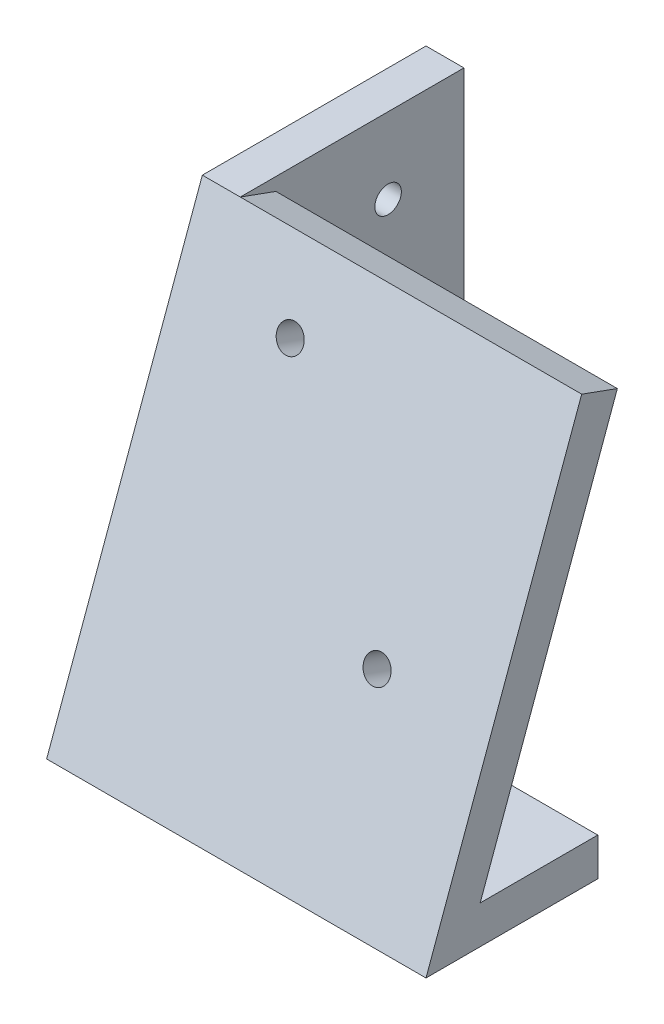
ISO-10303-21;
HEADER;
FILE_DESCRIPTION(('STEP AP214'),'2;1');
FILE_NAME('part.step','',(''),(''),'','','');
FILE_SCHEMA(('AUTOMOTIVE_DESIGN { 1 0 10303 214 1 1 1 1 }'));
ENDSEC;
DATA;
#1=APPLICATION_CONTEXT('core data for automotive mechanical design processes');
#2=APPLICATION_PROTOCOL_DEFINITION('international standard','automotive_design',2000,#1);
#3=PRODUCT_CONTEXT('',#1,'mechanical');
#4=PRODUCT('Part','Part','',(#3));
#5=PRODUCT_RELATED_PRODUCT_CATEGORY('part','',(#4));
#6=PRODUCT_DEFINITION_FORMATION('','',#4);
#7=PRODUCT_DEFINITION_CONTEXT('part definition',#1,'design');
#8=PRODUCT_DEFINITION('design','',#6,#7);
#9=PRODUCT_DEFINITION_SHAPE('','',#8);
#10=(LENGTH_UNIT() NAMED_UNIT(*) SI_UNIT(.MILLI.,.METRE.));
#11=(NAMED_UNIT(*) PLANE_ANGLE_UNIT() SI_UNIT($,.RADIAN.));
#12=(NAMED_UNIT(*) SI_UNIT($,.STERADIAN.) SOLID_ANGLE_UNIT());
#13=UNCERTAINTY_MEASURE_WITH_UNIT(LENGTH_MEASURE(1.E-05),#10,'distance_accuracy_value','');
#14=(GEOMETRIC_REPRESENTATION_CONTEXT(3) GLOBAL_UNCERTAINTY_ASSIGNED_CONTEXT((#13)) GLOBAL_UNIT_ASSIGNED_CONTEXT((#10,
#11,#12)) REPRESENTATION_CONTEXT('',''));
#15=CARTESIAN_POINT('',(0.,0.,0.));
#16=DIRECTION('',(0.,0.,1.));
#17=DIRECTION('',(1.,0.,0.));
#18=AXIS2_PLACEMENT_3D('',#15,#16,#17);
#19=CARTESIAN_POINT('',(25.,5.,42.8592599662894));
#20=DIRECTION('',(0.,-1.,0.));
#21=DIRECTION('',(0.,0.,-1.));
#22=AXIS2_PLACEMENT_3D('',#19,#20,#21);
#23=PLANE('',#22);
#24=CARTESIAN_POINT('',(-10.,5.,32.6992599662894));
#25=DIRECTION('',(0.,1.,0.));
#26=DIRECTION('',(0.,0.,1.));
#27=AXIS2_PLACEMENT_3D('',#24,#25,#26);
#28=CIRCLE('',#27,1.75);
#29=CARTESIAN_POINT('',(-10.,5.,34.4492599662894));
#30=VERTEX_POINT('',#29);
#31=EDGE_CURVE('E215',#30,#30,#28,.T.);
#32=ORIENTED_EDGE('',*,*,#31,.F.);
#33=EDGE_LOOP('',(#32));
#34=FACE_BOUND('',#33,.T.);
#35=CARTESIAN_POINT('',(10.,5.,32.6992599662894));
#36=DIRECTION('',(0.,1.,0.));
#37=DIRECTION('',(0.,0.,1.));
#38=AXIS2_PLACEMENT_3D('',#35,#36,#37);
#39=CIRCLE('',#38,1.75);
#40=CARTESIAN_POINT('',(10.,5.,34.4492599662894));
#41=VERTEX_POINT('',#40);
#42=EDGE_CURVE('E209',#41,#41,#39,.T.);
#43=ORIENTED_EDGE('',*,*,#42,.F.);
#44=EDGE_LOOP('',(#43));
#45=FACE_BOUND('',#44,.T.);
#46=DIRECTION('',(1.,0.,0.));
#47=VECTOR('',#46,1.);
#48=CARTESIAN_POINT('',(-8.36220000000002,5.,27.3622));
#49=LINE('',#48,#47);
#50=CARTESIAN_POINT('',(-8.36220000000002,5.,27.3622));
#51=VERTEX_POINT('',#50);
#52=CARTESIAN_POINT('',(25.,5.,27.3622));
#53=VERTEX_POINT('',#52);
#54=EDGE_CURVE('E139',#51,#53,#49,.T.);
#55=ORIENTED_EDGE('',*,*,#54,.F.);
#56=DIRECTION('',(0.,0.,1.));
#57=VECTOR('',#56,1.);
#58=CARTESIAN_POINT('',(-8.36220000000002,5.,5.));
#59=LINE('',#58,#57);
#60=CARTESIAN_POINT('',(-8.36220000000002,5.,5.));
#61=VERTEX_POINT('',#60);
#62=EDGE_CURVE('E122',#61,#51,#59,.T.);
#63=ORIENTED_EDGE('',*,*,#62,.F.);
#64=DIRECTION('',(1.,0.,0.));
#65=VECTOR('',#64,1.);
#66=CARTESIAN_POINT('',(-20.,5.,5.));
#67=LINE('',#66,#65);
#68=CARTESIAN_POINT('',(-20.,5.,5.));
#69=VERTEX_POINT('',#68);
#70=EDGE_CURVE('E150',#69,#61,#67,.T.);
#71=ORIENTED_EDGE('',*,*,#70,.F.);
#72=DIRECTION('',(0.,0.,1.));
#73=VECTOR('',#72,1.);
#74=CARTESIAN_POINT('',(-20.,5.,50.002));
#75=LINE('',#74,#73);
#76=CARTESIAN_POINT('',(-20.,5.,42.8592599662894));
#77=VERTEX_POINT('',#76);
#78=EDGE_CURVE('E63',#69,#77,#75,.T.);
#79=ORIENTED_EDGE('',*,*,#78,.T.);
#80=DIRECTION('',(-1.,0.,0.));
#81=VECTOR('',#80,1.);
#82=CARTESIAN_POINT('',(25.,5.,42.8592599662894));
#83=LINE('',#82,#81);
#84=CARTESIAN_POINT('',(25.,5.,42.8592599662894));
#85=VERTEX_POINT('',#84);
#86=EDGE_CURVE('E11',#85,#77,#83,.T.);
#87=ORIENTED_EDGE('',*,*,#86,.F.);
#88=DIRECTION('',(0.,0.,-1.));
#89=VECTOR('',#88,1.);
#90=CARTESIAN_POINT('',(25.,5.,0.));
#91=LINE('',#90,#89);
#92=EDGE_CURVE('E156',#85,#53,#91,.T.);
#93=ORIENTED_EDGE('',*,*,#92,.T.);
#94=EDGE_LOOP('',(#55,#63,#71,#79,#87,#93));
#95=FACE_BOUND('',#94,.T.);
#96=ADVANCED_FACE('F40',(#34,#45,#95),#23,.F.);
#97=CARTESIAN_POINT('',(25.,54.6714565305261,24.7803282965301));
#98=DIRECTION('',(0.,0.342020143325673,0.939692620785907));
#99=DIRECTION('',(0.,-0.939692620785907,0.342020143325673));
#100=AXIS2_PLACEMENT_3D('',#97,#98,#99);
#101=PLANE('',#100);
#102=CARTESIAN_POINT('',(10.,21.7822148030193,36.7510333129287));
#103=DIRECTION('',(0.,0.342020143325672,0.939692620785907));
#104=DIRECTION('',(0.,-0.939692620785907,0.342020143325672));
#105=AXIS2_PLACEMENT_3D('',#102,#103,#104);
#106=CIRCLE('',#105,1.75);
#107=CARTESIAN_POINT('',(10.,20.137752716644,37.3495685637486));
#108=VERTEX_POINT('',#107);
#109=EDGE_CURVE('E206',#108,#108,#106,.T.);
#110=ORIENTED_EDGE('',*,*,#109,.T.);
#111=EDGE_LOOP('',(#110));
#112=FACE_BOUND('',#111,.T.);
#113=CARTESIAN_POINT('',(-10.,45.274530322667,28.2005297297869));
#114=DIRECTION('',(0.,0.342020143325672,0.939692620785907));
#115=DIRECTION('',(0.,-0.939692620785907,0.342020143325672));
#116=AXIS2_PLACEMENT_3D('',#113,#114,#115);
#117=CIRCLE('',#116,1.75);
#118=CARTESIAN_POINT('',(-10.,43.6300682362917,28.7990649806068));
#119=VERTEX_POINT('',#118);
#120=EDGE_CURVE('E200',#119,#119,#117,.T.);
#121=ORIENTED_EDGE('',*,*,#120,.T.);
#122=EDGE_LOOP('',(#121));
#123=FACE_BOUND('',#122,.T.);
#124=DIRECTION('',(0.,0.939692620785907,-0.342020143325673));
#125=VECTOR('',#124,1.);
#126=CARTESIAN_POINT('',(-20.,-1.71074350423805,45.3017708516274));
#127=LINE('',#126,#125);
#128=CARTESIAN_POINT('',(-20.,54.6714565305261,24.7803282965301));
#129=VERTEX_POINT('',#128);
#130=EDGE_CURVE('E189',#77,#129,#127,.T.);
#131=ORIENTED_EDGE('',*,*,#130,.T.);
#132=DIRECTION('',(-1.,0.,0.));
#133=VECTOR('',#132,1.);
#134=CARTESIAN_POINT('',(25.,54.6714565305261,24.7803282965301));
#135=LINE('',#134,#133);
#136=CARTESIAN_POINT('',(25.,54.6714565305261,24.7803282965301));
#137=VERTEX_POINT('',#136);
#138=EDGE_CURVE('E48',#137,#129,#135,.T.);
#139=ORIENTED_EDGE('',*,*,#138,.F.);
#140=DIRECTION('',(0.,-0.939692620785907,0.342020143325673));
#141=VECTOR('',#140,1.);
#142=CARTESIAN_POINT('',(25.,5.,42.8592599662894));
#143=LINE('',#142,#141);
#144=EDGE_CURVE('E159',#137,#85,#143,.T.);
#145=ORIENTED_EDGE('',*,*,#144,.T.);
#146=ORIENTED_EDGE('',*,*,#86,.T.);
#147=EDGE_LOOP('',(#131,#139,#145,#146));
#148=FACE_BOUND('',#147,.T.);
#149=ADVANCED_FACE('F266',(#112,#123,#148),#101,.F.);
#150=CARTESIAN_POINT('',(25.,56.3815572471544,29.4787914004597));
#151=DIRECTION('',(0.,-0.939692620785908,0.342020143325671));
#152=DIRECTION('',(0.,-0.342020143325671,-0.939692620785908));
#153=AXIS2_PLACEMENT_3D('',#150,#151,#152);
#154=PLANE('',#153);
#155=DIRECTION('',(0.,0.342020143325671,0.939692620785908));
#156=VECTOR('',#155,1.);
#157=CARTESIAN_POINT('',(-20.,56.3822000347642,29.4805574449029));
#158=LINE('',#157,#156);
#159=CARTESIAN_POINT('',(-20.,56.3815572471544,29.4787914004597));
#160=VERTEX_POINT('',#159);
#161=EDGE_CURVE('E191',#129,#160,#158,.T.);
#162=ORIENTED_EDGE('',*,*,#161,.T.);
#163=DIRECTION('',(-1.,0.,0.));
#164=VECTOR('',#163,1.);
#165=CARTESIAN_POINT('',(25.,56.3815572471544,29.4787914004597));
#166=LINE('',#165,#164);
#167=CARTESIAN_POINT('',(25.,56.3815572471544,29.4787914004597));
#168=VERTEX_POINT('',#167);
#169=EDGE_CURVE('E237',#168,#160,#166,.T.);
#170=ORIENTED_EDGE('',*,*,#169,.F.);
#171=DIRECTION('',(0.,-0.342020143325669,-0.939692620785908));
#172=VECTOR('',#171,1.);
#173=CARTESIAN_POINT('',(25.,54.6714565305261,24.7803282965301));
#174=LINE('',#173,#172);
#175=EDGE_CURVE('E162',#168,#137,#174,.T.);
#176=ORIENTED_EDGE('',*,*,#175,.T.);
#177=ORIENTED_EDGE('',*,*,#138,.T.);
#178=EDGE_LOOP('',(#162,#170,#176,#177));
#179=FACE_BOUND('',#178,.T.);
#180=ADVANCED_FACE('F241',(#179),#154,.F.);
#181=CARTESIAN_POINT('',(25.,5.,0.));
#182=DIRECTION('',(0.,0.,1.));
#183=DIRECTION('',(0.,-1.,0.));
#184=AXIS2_PLACEMENT_3D('',#181,#182,#183);
#185=PLANE('',#184);
#186=DIRECTION('',(0.,1.,0.));
#187=VECTOR('',#186,1.);
#188=CARTESIAN_POINT('',(-20.,0.,0.));
#189=LINE('',#188,#187);
#190=CARTESIAN_POINT('',(-20.,0.,0.));
#191=VERTEX_POINT('',#190);
#192=CARTESIAN_POINT('',(-20.,56.3815572471544,0.));
#193=VERTEX_POINT('',#192);
#194=EDGE_CURVE('E178',#191,#193,#189,.T.);
#195=ORIENTED_EDGE('',*,*,#194,.F.);
#196=DIRECTION('',(-1.,0.,0.));
#197=VECTOR('',#196,1.);
#198=CARTESIAN_POINT('',(25.,0.,0.));
#199=LINE('',#198,#197);
#200=CARTESIAN_POINT('',(-25.,0.,0.));
#201=VERTEX_POINT('',#200);
#202=EDGE_CURVE('E227',#191,#201,#199,.T.);
#203=ORIENTED_EDGE('',*,*,#202,.T.);
#204=DIRECTION('',(0.,1.,0.));
#205=VECTOR('',#204,1.);
#206=CARTESIAN_POINT('',(-25.,5.,0.));
#207=LINE('',#206,#205);
#208=CARTESIAN_POINT('',(-25.,56.3815572471544,0.));
#209=VERTEX_POINT('',#208);
#210=EDGE_CURVE('E221',#201,#209,#207,.T.);
#211=ORIENTED_EDGE('',*,*,#210,.T.);
#212=DIRECTION('',(-1.,0.,0.));
#213=VECTOR('',#212,1.);
#214=CARTESIAN_POINT('',(-25.,56.3815572471544,0.));
#215=LINE('',#214,#213);
#216=EDGE_CURVE('E177',#193,#209,#215,.T.);
#217=ORIENTED_EDGE('',*,*,#216,.F.);
#218=EDGE_LOOP('',(#195,#203,#211,#217));
#219=FACE_BOUND('',#218,.T.);
#220=ADVANCED_FACE('F42',(#219),#185,.F.);
#221=CARTESIAN_POINT('',(25.,0.,50.));
#222=DIRECTION('',(0.,-0.342020143325672,-0.939692620785907));
#223=DIRECTION('',(0.,0.939692620785907,-0.342020143325672));
#224=AXIS2_PLACEMENT_3D('',#221,#222,#223);
#225=PLANE('',#224);
#226=CARTESIAN_POINT('',(-10.,46.9846310392954,32.8989928337164));
#227=DIRECTION('',(0.,0.342020143325672,0.939692620785907));
#228=DIRECTION('',(0.,-0.939692620785907,0.342020143325672));
#229=AXIS2_PLACEMENT_3D('',#226,#227,#228);
#230=CIRCLE('',#229,1.75);
#231=CARTESIAN_POINT('',(-10.,45.34016895292,33.4975280845363));
#232=VERTEX_POINT('',#231);
#233=EDGE_CURVE('E197',#232,#232,#230,.T.);
#234=ORIENTED_EDGE('',*,*,#233,.F.);
#235=EDGE_LOOP('',(#234));
#236=FACE_BOUND('',#235,.T.);
#237=CARTESIAN_POINT('',(10.,23.4923155196477,41.4494964168582));
#238=DIRECTION('',(0.,0.342020143325672,0.939692620785907));
#239=DIRECTION('',(0.,-0.939692620785907,0.342020143325672));
#240=AXIS2_PLACEMENT_3D('',#237,#238,#239);
#241=CIRCLE('',#240,1.75);
#242=CARTESIAN_POINT('',(10.,21.8478534332723,42.0480316676781));
#243=VERTEX_POINT('',#242);
#244=EDGE_CURVE('E203',#243,#243,#241,.T.);
#245=ORIENTED_EDGE('',*,*,#244,.F.);
#246=EDGE_LOOP('',(#245));
#247=FACE_BOUND('',#246,.T.);
#248=DIRECTION('',(0.,-0.939692620785907,0.342020143325672));
#249=VECTOR('',#248,1.);
#250=CARTESIAN_POINT('',(-25.,0.,50.));
#251=LINE('',#250,#249);
#252=CARTESIAN_POINT('',(-25.,56.3815572471544,29.4787914004597));
#253=VERTEX_POINT('',#252);
#254=CARTESIAN_POINT('',(-25.,0.,50.));
#255=VERTEX_POINT('',#254);
#256=EDGE_CURVE('E229',#253,#255,#251,.T.);
#257=ORIENTED_EDGE('',*,*,#256,.T.);
#258=DIRECTION('',(-1.,0.,0.));
#259=VECTOR('',#258,1.);
#260=CARTESIAN_POINT('',(25.,0.,50.));
#261=LINE('',#260,#259);
#262=CARTESIAN_POINT('',(25.,0.,50.));
#263=VERTEX_POINT('',#262);
#264=EDGE_CURVE('E234',#263,#255,#261,.T.);
#265=ORIENTED_EDGE('',*,*,#264,.F.);
#266=DIRECTION('',(0.,-0.939692620785907,0.342020143325672));
#267=VECTOR('',#266,1.);
#268=CARTESIAN_POINT('',(25.,0.,50.));
#269=LINE('',#268,#267);
#270=EDGE_CURVE('E222',#168,#263,#269,.T.);
#271=ORIENTED_EDGE('',*,*,#270,.F.);
#272=ORIENTED_EDGE('',*,*,#169,.T.);
#273=DIRECTION('',(1.,0.,0.));
#274=VECTOR('',#273,1.);
#275=CARTESIAN_POINT('',(-25.,56.3815572471544,29.4787914004597));
#276=LINE('',#275,#274);
#277=EDGE_CURVE('E187',#253,#160,#276,.T.);
#278=ORIENTED_EDGE('',*,*,#277,.F.);
#279=EDGE_LOOP('',(#257,#265,#271,#272,#278));
#280=FACE_BOUND('',#279,.T.);
#281=ADVANCED_FACE('F255',(#236,#247,#280),#225,.F.);
#282=CARTESIAN_POINT('',(25.,0.,0.));
#283=DIRECTION('',(0.,1.,0.));
#284=DIRECTION('',(0.,0.,1.));
#285=AXIS2_PLACEMENT_3D('',#282,#283,#284);
#286=PLANE('',#285);
#287=CARTESIAN_POINT('',(10.,0.,32.6992599662894));
#288=DIRECTION('',(0.,1.,0.));
#289=DIRECTION('',(0.,0.,1.));
#290=AXIS2_PLACEMENT_3D('',#287,#288,#289);
#291=CIRCLE('',#290,1.75);
#292=CARTESIAN_POINT('',(10.,0.,34.4492599662894));
#293=VERTEX_POINT('',#292);
#294=EDGE_CURVE('E212',#293,#293,#291,.T.);
#295=ORIENTED_EDGE('',*,*,#294,.T.);
#296=EDGE_LOOP('',(#295));
#297=FACE_BOUND('',#296,.T.);
#298=CARTESIAN_POINT('',(-10.,0.,32.6992599662894));
#299=DIRECTION('',(0.,1.,0.));
#300=DIRECTION('',(0.,0.,1.));
#301=AXIS2_PLACEMENT_3D('',#298,#299,#300);
#302=CIRCLE('',#301,1.75);
#303=CARTESIAN_POINT('',(-10.,0.,34.4492599662894));
#304=VERTEX_POINT('',#303);
#305=EDGE_CURVE('E218',#304,#304,#302,.T.);
#306=ORIENTED_EDGE('',*,*,#305,.T.);
#307=EDGE_LOOP('',(#306));
#308=FACE_BOUND('',#307,.T.);
#309=DIRECTION('',(-1.,0.,0.));
#310=VECTOR('',#309,1.);
#311=CARTESIAN_POINT('',(-20.,0.,5.));
#312=LINE('',#311,#310);
#313=CARTESIAN_POINT('',(-8.36220000000002,0.,5.));
#314=VERTEX_POINT('',#313);
#315=CARTESIAN_POINT('',(-20.,0.,5.));
#316=VERTEX_POINT('',#315);
#317=EDGE_CURVE('E138',#314,#316,#312,.T.);
#318=ORIENTED_EDGE('',*,*,#317,.F.);
#319=DIRECTION('',(0.,0.,1.));
#320=VECTOR('',#319,1.);
#321=CARTESIAN_POINT('',(-8.36220000000002,0.,5.));
#322=LINE('',#321,#320);
#323=CARTESIAN_POINT('',(-8.36220000000002,0.,27.3622));
#324=VERTEX_POINT('',#323);
#325=EDGE_CURVE('E55',#314,#324,#322,.T.);
#326=ORIENTED_EDGE('',*,*,#325,.T.);
#327=DIRECTION('',(1.,0.,0.));
#328=VECTOR('',#327,1.);
#329=CARTESIAN_POINT('',(-8.36220000000002,0.,27.3622));
#330=LINE('',#329,#328);
#331=CARTESIAN_POINT('',(25.,0.,27.3622));
#332=VERTEX_POINT('',#331);
#333=EDGE_CURVE('E126',#324,#332,#330,.T.);
#334=ORIENTED_EDGE('',*,*,#333,.T.);
#335=DIRECTION('',(0.,0.,-1.));
#336=VECTOR('',#335,1.);
#337=CARTESIAN_POINT('',(25.,0.,0.));
#338=LINE('',#337,#336);
#339=EDGE_CURVE('E224',#263,#332,#338,.T.);
#340=ORIENTED_EDGE('',*,*,#339,.F.);
#341=ORIENTED_EDGE('',*,*,#264,.T.);
#342=DIRECTION('',(0.,0.,-1.));
#343=VECTOR('',#342,1.);
#344=CARTESIAN_POINT('',(-25.,0.,0.));
#345=LINE('',#344,#343);
#346=EDGE_CURVE('E225',#255,#201,#345,.T.);
#347=ORIENTED_EDGE('',*,*,#346,.T.);
#348=ORIENTED_EDGE('',*,*,#202,.F.);
#349=DIRECTION('',(0.,0.,-1.));
#350=VECTOR('',#349,1.);
#351=CARTESIAN_POINT('',(-20.,0.,0.));
#352=LINE('',#351,#350);
#353=EDGE_CURVE('E146',#316,#191,#352,.T.);
#354=ORIENTED_EDGE('',*,*,#353,.F.);
#355=EDGE_LOOP('',(#318,#326,#334,#340,#341,#347,#348,#354));
#356=FACE_BOUND('',#355,.T.);
#357=ADVANCED_FACE('F136',(#297,#308,#356),#286,.F.);
#358=CARTESIAN_POINT('',(25.,0.,0.));
#359=DIRECTION('',(-1.,0.,0.));
#360=DIRECTION('',(0.,0.,1.));
#361=AXIS2_PLACEMENT_3D('',#358,#359,#360);
#362=PLANE('',#361);
#363=ORIENTED_EDGE('',*,*,#339,.T.);
#364=DIRECTION('',(0.,1.,0.));
#365=VECTOR('',#364,1.);
#366=CARTESIAN_POINT('',(25.,0.,27.3622));
#367=LINE('',#366,#365);
#368=EDGE_CURVE('E125',#332,#53,#367,.T.);
#369=ORIENTED_EDGE('',*,*,#368,.T.);
#370=ORIENTED_EDGE('',*,*,#92,.F.);
#371=ORIENTED_EDGE('',*,*,#144,.F.);
#372=ORIENTED_EDGE('',*,*,#175,.F.);
#373=ORIENTED_EDGE('',*,*,#270,.T.);
#374=EDGE_LOOP('',(#363,#369,#370,#371,#372,#373));
#375=FACE_BOUND('',#374,.T.);
#376=ADVANCED_FACE('F264',(#375),#362,.F.);
#377=CARTESIAN_POINT('',(-25.,0.,0.));
#378=DIRECTION('',(-1.,0.,0.));
#379=DIRECTION('',(0.,0.,1.));
#380=AXIS2_PLACEMENT_3D('',#377,#378,#379);
#381=PLANE('',#380);
#382=CARTESIAN_POINT('',(-25.,46.3815572471544,10.));
#383=DIRECTION('',(1.,0.,0.));
#384=DIRECTION('',(0.,0.,-1.));
#385=AXIS2_PLACEMENT_3D('',#382,#383,#384);
#386=CIRCLE('',#385,1.75);
#387=CARTESIAN_POINT('',(-25.,46.3815572471544,8.25));
#388=VERTEX_POINT('',#387);
#389=EDGE_CURVE('E168',#388,#388,#386,.T.);
#390=ORIENTED_EDGE('',*,*,#389,.T.);
#391=EDGE_LOOP('',(#390));
#392=FACE_BOUND('',#391,.T.);
#393=CARTESIAN_POINT('',(-25.,20.,25.));
#394=DIRECTION('',(1.,0.,0.));
#395=DIRECTION('',(0.,0.,-1.));
#396=AXIS2_PLACEMENT_3D('',#393,#394,#395);
#397=CIRCLE('',#396,1.75);
#398=CARTESIAN_POINT('',(-25.,20.,23.25));
#399=VERTEX_POINT('',#398);
#400=EDGE_CURVE('E174',#399,#399,#397,.T.);
#401=ORIENTED_EDGE('',*,*,#400,.T.);
#402=EDGE_LOOP('',(#401));
#403=FACE_BOUND('',#402,.T.);
#404=ORIENTED_EDGE('',*,*,#256,.F.);
#405=DIRECTION('',(0.,0.,-1.));
#406=VECTOR('',#405,1.);
#407=CARTESIAN_POINT('',(-25.,56.3815572471544,50.002));
#408=LINE('',#407,#406);
#409=EDGE_CURVE('E184',#253,#209,#408,.T.);
#410=ORIENTED_EDGE('',*,*,#409,.T.);
#411=ORIENTED_EDGE('',*,*,#210,.F.);
#412=ORIENTED_EDGE('',*,*,#346,.F.);
#413=EDGE_LOOP('',(#404,#410,#411,#412));
#414=FACE_BOUND('',#413,.T.);
#415=ADVANCED_FACE('F260',(#392,#403,#414),#381,.T.);
#416=CARTESIAN_POINT('',(-10.,5.,32.6992599662894));
#417=DIRECTION('',(0.,1.,0.));
#418=DIRECTION('',(0.,0.,1.));
#419=AXIS2_PLACEMENT_3D('',#416,#417,#418);
#420=CYLINDRICAL_SURFACE('',#419,1.75);
#421=ORIENTED_EDGE('',*,*,#305,.F.);
#422=EDGE_LOOP('',(#421));
#423=FACE_BOUND('',#422,.T.);
#424=ORIENTED_EDGE('',*,*,#31,.T.);
#425=EDGE_LOOP('',(#424));
#426=FACE_BOUND('',#425,.T.);
#427=ADVANCED_FACE('F304',(#423,#426),#420,.F.);
#428=CARTESIAN_POINT('',(10.,5.,32.6992599662894));
#429=DIRECTION('',(0.,1.,0.));
#430=DIRECTION('',(0.,0.,1.));
#431=AXIS2_PLACEMENT_3D('',#428,#429,#430);
#432=CYLINDRICAL_SURFACE('',#431,1.75);
#433=ORIENTED_EDGE('',*,*,#294,.F.);
#434=EDGE_LOOP('',(#433));
#435=FACE_BOUND('',#434,.T.);
#436=ORIENTED_EDGE('',*,*,#42,.T.);
#437=EDGE_LOOP('',(#436));
#438=FACE_BOUND('',#437,.T.);
#439=ADVANCED_FACE('F309',(#435,#438),#432,.F.);
#440=CARTESIAN_POINT('',(10.,23.4923155196477,41.4494964168582));
#441=DIRECTION('',(0.,0.342020143325672,0.939692620785907));
#442=DIRECTION('',(0.,-0.939692620785907,0.342020143325672));
#443=AXIS2_PLACEMENT_3D('',#440,#441,#442);
#444=CYLINDRICAL_SURFACE('',#443,1.75);
#445=ORIENTED_EDGE('',*,*,#109,.F.);
#446=EDGE_LOOP('',(#445));
#447=FACE_BOUND('',#446,.T.);
#448=ORIENTED_EDGE('',*,*,#244,.T.);
#449=EDGE_LOOP('',(#448));
#450=FACE_BOUND('',#449,.T.);
#451=ADVANCED_FACE('F313',(#447,#450),#444,.F.);
#452=CARTESIAN_POINT('',(-10.,46.9846310392954,32.8989928337164));
#453=DIRECTION('',(0.,0.342020143325672,0.939692620785907));
#454=DIRECTION('',(0.,-0.939692620785907,0.342020143325672));
#455=AXIS2_PLACEMENT_3D('',#452,#453,#454);
#456=CYLINDRICAL_SURFACE('',#455,1.75);
#457=ORIENTED_EDGE('',*,*,#120,.F.);
#458=EDGE_LOOP('',(#457));
#459=FACE_BOUND('',#458,.T.);
#460=ORIENTED_EDGE('',*,*,#233,.T.);
#461=EDGE_LOOP('',(#460));
#462=FACE_BOUND('',#461,.T.);
#463=ADVANCED_FACE('F317',(#459,#462),#456,.F.);
#464=CARTESIAN_POINT('',(-25.,56.3815572471544,50.002));
#465=DIRECTION('',(0.,-1.,0.));
#466=DIRECTION('',(0.,0.,-1.));
#467=AXIS2_PLACEMENT_3D('',#464,#465,#466);
#468=PLANE('',#467);
#469=ORIENTED_EDGE('',*,*,#409,.F.);
#470=ORIENTED_EDGE('',*,*,#277,.T.);
#471=DIRECTION('',(0.,0.,-1.));
#472=VECTOR('',#471,1.);
#473=CARTESIAN_POINT('',(-20.,56.3815572471544,50.002));
#474=LINE('',#473,#472);
#475=EDGE_CURVE('E181',#160,#193,#474,.T.);
#476=ORIENTED_EDGE('',*,*,#475,.T.);
#477=ORIENTED_EDGE('',*,*,#216,.T.);
#478=EDGE_LOOP('',(#469,#470,#476,#477));
#479=FACE_BOUND('',#478,.T.);
#480=ADVANCED_FACE('F252',(#479),#468,.F.);
#481=CARTESIAN_POINT('',(-20.,0.,50.002));
#482=DIRECTION('',(-1.,0.,0.));
#483=DIRECTION('',(0.,0.,1.));
#484=AXIS2_PLACEMENT_3D('',#481,#482,#483);
#485=PLANE('',#484);
#486=CARTESIAN_POINT('',(-20.,46.3815572471544,10.));
#487=DIRECTION('',(1.,0.,0.));
#488=DIRECTION('',(0.,0.,-1.));
#489=AXIS2_PLACEMENT_3D('',#486,#487,#488);
#490=CIRCLE('',#489,1.75);
#491=CARTESIAN_POINT('',(-20.,46.3815572471544,8.25));
#492=VERTEX_POINT('',#491);
#493=EDGE_CURVE('E165',#492,#492,#490,.T.);
#494=ORIENTED_EDGE('',*,*,#493,.F.);
#495=EDGE_LOOP('',(#494));
#496=FACE_BOUND('',#495,.T.);
#497=CARTESIAN_POINT('',(-20.,20.,25.));
#498=DIRECTION('',(1.,0.,0.));
#499=DIRECTION('',(0.,0.,-1.));
#500=AXIS2_PLACEMENT_3D('',#497,#498,#499);
#501=CIRCLE('',#500,1.75);
#502=CARTESIAN_POINT('',(-20.,20.,23.25));
#503=VERTEX_POINT('',#502);
#504=EDGE_CURVE('E171',#503,#503,#501,.T.);
#505=ORIENTED_EDGE('',*,*,#504,.F.);
#506=EDGE_LOOP('',(#505));
#507=FACE_BOUND('',#506,.T.);
#508=ORIENTED_EDGE('',*,*,#161,.F.);
#509=ORIENTED_EDGE('',*,*,#130,.F.);
#510=ORIENTED_EDGE('',*,*,#78,.F.);
#511=DIRECTION('',(0.,1.,0.));
#512=VECTOR('',#511,1.);
#513=CARTESIAN_POINT('',(-20.,-0.0010000000000062,5.));
#514=LINE('',#513,#512);
#515=EDGE_CURVE('E153',#316,#69,#514,.T.);
#516=ORIENTED_EDGE('',*,*,#515,.F.);
#517=ORIENTED_EDGE('',*,*,#353,.T.);
#518=ORIENTED_EDGE('',*,*,#194,.T.);
#519=ORIENTED_EDGE('',*,*,#475,.F.);
#520=EDGE_LOOP('',(#508,#509,#510,#516,#517,#518,#519));
#521=FACE_BOUND('',#520,.T.);
#522=ADVANCED_FACE('F248',(#496,#507,#521),#485,.F.);
#523=CARTESIAN_POINT('',(-20.,20.,25.));
#524=DIRECTION('',(1.,0.,0.));
#525=DIRECTION('',(0.,0.,-1.));
#526=AXIS2_PLACEMENT_3D('',#523,#524,#525);
#527=CYLINDRICAL_SURFACE('',#526,1.75);
#528=ORIENTED_EDGE('',*,*,#400,.F.);
#529=EDGE_LOOP('',(#528));
#530=FACE_BOUND('',#529,.T.);
#531=ORIENTED_EDGE('',*,*,#504,.T.);
#532=EDGE_LOOP('',(#531));
#533=FACE_BOUND('',#532,.T.);
#534=ADVANCED_FACE('F280',(#530,#533),#527,.F.);
#535=CARTESIAN_POINT('',(-20.,46.3815572471544,10.));
#536=DIRECTION('',(1.,0.,0.));
#537=DIRECTION('',(0.,0.,-1.));
#538=AXIS2_PLACEMENT_3D('',#535,#536,#537);
#539=CYLINDRICAL_SURFACE('',#538,1.75);
#540=ORIENTED_EDGE('',*,*,#389,.F.);
#541=EDGE_LOOP('',(#540));
#542=FACE_BOUND('',#541,.T.);
#543=ORIENTED_EDGE('',*,*,#493,.T.);
#544=EDGE_LOOP('',(#543));
#545=FACE_BOUND('',#544,.T.);
#546=ADVANCED_FACE('F271',(#542,#545),#539,.F.);
#547=CARTESIAN_POINT('',(-20.,-0.0010000000000062,5.));
#548=DIRECTION('',(0.,0.,1.));
#549=DIRECTION('',(1.,0.,0.));
#550=AXIS2_PLACEMENT_3D('',#547,#548,#549);
#551=PLANE('',#550);
#552=ORIENTED_EDGE('',*,*,#70,.T.);
#553=DIRECTION('',(0.,1.,0.));
#554=VECTOR('',#553,1.);
#555=CARTESIAN_POINT('',(-8.36220000000002,0.,5.));
#556=LINE('',#555,#554);
#557=EDGE_CURVE('E144',#314,#61,#556,.T.);
#558=ORIENTED_EDGE('',*,*,#557,.F.);
#559=ORIENTED_EDGE('',*,*,#317,.T.);
#560=ORIENTED_EDGE('',*,*,#515,.T.);
#561=EDGE_LOOP('',(#552,#558,#559,#560));
#562=FACE_BOUND('',#561,.T.);
#563=ADVANCED_FACE('F268',(#562),#551,.F.);
#564=CARTESIAN_POINT('',(-8.36220000000002,0.,5.));
#565=DIRECTION('',(-1.,0.,0.));
#566=DIRECTION('',(0.,0.,1.));
#567=AXIS2_PLACEMENT_3D('',#564,#565,#566);
#568=PLANE('',#567);
#569=ORIENTED_EDGE('',*,*,#62,.T.);
#570=DIRECTION('',(0.,1.,0.));
#571=VECTOR('',#570,1.);
#572=CARTESIAN_POINT('',(-8.36220000000002,0.,27.3622));
#573=LINE('',#572,#571);
#574=EDGE_CURVE('E118',#324,#51,#573,.T.);
#575=ORIENTED_EDGE('',*,*,#574,.F.);
#576=ORIENTED_EDGE('',*,*,#325,.F.);
#577=ORIENTED_EDGE('',*,*,#557,.T.);
#578=EDGE_LOOP('',(#569,#575,#576,#577));
#579=FACE_BOUND('',#578,.T.);
#580=ADVANCED_FACE('F120',(#579),#568,.F.);
#581=CARTESIAN_POINT('',(-8.36220000000002,0.,27.3622));
#582=DIRECTION('',(0.,0.,1.));
#583=DIRECTION('',(1.,0.,0.));
#584=AXIS2_PLACEMENT_3D('',#581,#582,#583);
#585=PLANE('',#584);
#586=ORIENTED_EDGE('',*,*,#54,.T.);
#587=ORIENTED_EDGE('',*,*,#368,.F.);
#588=ORIENTED_EDGE('',*,*,#333,.F.);
#589=ORIENTED_EDGE('',*,*,#574,.T.);
#590=EDGE_LOOP('',(#586,#587,#588,#589));
#591=FACE_BOUND('',#590,.T.);
#592=ADVANCED_FACE('F129',(#591),#585,.F.);
#593=CLOSED_SHELL('',(#96,#149,#180,#220,#281,#357,#376,#415,#427,#439,#451,#463,#480,#522,#534,
#546,#563,#580,#592));
#594=MANIFOLD_SOLID_BREP('B2',#593);
#595=ADVANCED_BREP_SHAPE_REPRESENTATION('',(#18,#594),#14);
#596=SHAPE_DEFINITION_REPRESENTATION(#9,#595);
ENDSEC;
END-ISO-10303-21;
